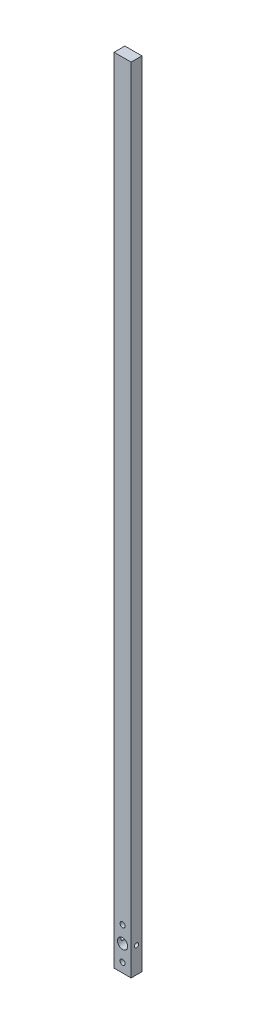
ISO-10303-21;
HEADER;
FILE_DESCRIPTION(('STEP AP214'),'2;1');
FILE_NAME('part.step','',(''),(''),'','','');
FILE_SCHEMA(('AUTOMOTIVE_DESIGN { 1 0 10303 214 1 1 1 1 }'));
ENDSEC;
DATA;
#1=APPLICATION_CONTEXT('core data for automotive mechanical design processes');
#2=APPLICATION_PROTOCOL_DEFINITION('international standard','automotive_design',2000,#1);
#3=PRODUCT_CONTEXT('',#1,'mechanical');
#4=PRODUCT('Part','Part','',(#3));
#5=PRODUCT_RELATED_PRODUCT_CATEGORY('part','',(#4));
#6=PRODUCT_DEFINITION_FORMATION('','',#4);
#7=PRODUCT_DEFINITION_CONTEXT('part definition',#1,'design');
#8=PRODUCT_DEFINITION('design','',#6,#7);
#9=PRODUCT_DEFINITION_SHAPE('','',#8);
#10=(LENGTH_UNIT() NAMED_UNIT(*) SI_UNIT(.MILLI.,.METRE.));
#11=(NAMED_UNIT(*) PLANE_ANGLE_UNIT() SI_UNIT($,.RADIAN.));
#12=(NAMED_UNIT(*) SI_UNIT($,.STERADIAN.) SOLID_ANGLE_UNIT());
#13=UNCERTAINTY_MEASURE_WITH_UNIT(LENGTH_MEASURE(1.E-05),#10,'distance_accuracy_value','');
#14=(GEOMETRIC_REPRESENTATION_CONTEXT(3) GLOBAL_UNCERTAINTY_ASSIGNED_CONTEXT((#13)) GLOBAL_UNIT_ASSIGNED_CONTEXT((#10,
#11,#12)) REPRESENTATION_CONTEXT('',''));
#15=CARTESIAN_POINT('',(0.,0.,0.));
#16=DIRECTION('',(0.,0.,1.));
#17=DIRECTION('',(1.,0.,0.));
#18=AXIS2_PLACEMENT_3D('',#15,#16,#17);
#19=CARTESIAN_POINT('',(0.,0.,6.35));
#20=DIRECTION('',(0.,0.,1.));
#21=DIRECTION('',(1.,0.,0.));
#22=AXIS2_PLACEMENT_3D('',#19,#20,#21);
#23=PLANE('',#22);
#24=CARTESIAN_POINT('',(0.,0.,6.35));
#25=DIRECTION('',(0.,0.,1.));
#26=DIRECTION('',(1.,0.,0.));
#27=AXIS2_PLACEMENT_3D('',#24,#25,#26);
#28=CIRCLE('',#27,3.);
#29=CARTESIAN_POINT('',(3.,0.,6.35));
#30=VERTEX_POINT('',#29);
#31=EDGE_CURVE('E184',#30,#30,#28,.T.);
#32=ORIENTED_EDGE('',*,*,#31,.F.);
#33=EDGE_LOOP('',(#32));
#34=FACE_BOUND('',#33,.T.);
#35=DIRECTION('',(0.,-1.,0.));
#36=VECTOR('',#35,1.);
#37=CARTESIAN_POINT('',(-5.00000000000006,450.,6.35));
#38=LINE('',#37,#36);
#39=CARTESIAN_POINT('',(-5.00000000000006,450.,6.35));
#40=VERTEX_POINT('',#39);
#41=CARTESIAN_POINT('',(-5.,-15.,6.35));
#42=VERTEX_POINT('',#41);
#43=EDGE_CURVE('E93',#40,#42,#38,.T.);
#44=ORIENTED_EDGE('',*,*,#43,.T.);
#45=DIRECTION('',(1.,0.,0.));
#46=VECTOR('',#45,1.);
#47=CARTESIAN_POINT('',(-5.,-15.,6.35));
#48=LINE('',#47,#46);
#49=CARTESIAN_POINT('',(5.,-15.,6.35));
#50=VERTEX_POINT('',#49);
#51=EDGE_CURVE('E88',#42,#50,#48,.T.);
#52=ORIENTED_EDGE('',*,*,#51,.T.);
#53=DIRECTION('',(0.,1.,0.));
#54=VECTOR('',#53,1.);
#55=CARTESIAN_POINT('',(4.99999999999995,450.,6.35));
#56=LINE('',#55,#54);
#57=CARTESIAN_POINT('',(4.99999999999995,450.,6.35));
#58=VERTEX_POINT('',#57);
#59=EDGE_CURVE('E91',#50,#58,#56,.T.);
#60=ORIENTED_EDGE('',*,*,#59,.T.);
#61=DIRECTION('',(-1.,0.,0.));
#62=VECTOR('',#61,1.);
#63=CARTESIAN_POINT('',(-5.00000000000006,450.,6.35));
#64=LINE('',#63,#62);
#65=EDGE_CURVE('E58',#58,#40,#64,.T.);
#66=ORIENTED_EDGE('',*,*,#65,.T.);
#67=EDGE_LOOP('',(#44,#52,#60,#66));
#68=FACE_BOUND('',#67,.T.);
#69=CARTESIAN_POINT('',(0.,-9.5,6.35));
#70=DIRECTION('',(0.,0.,1.));
#71=DIRECTION('',(1.,0.,0.));
#72=AXIS2_PLACEMENT_3D('',#69,#70,#71);
#73=CIRCLE('',#72,1.5);
#74=CARTESIAN_POINT('',(1.5,-9.5,6.35));
#75=VERTEX_POINT('',#74);
#76=EDGE_CURVE('E109',#75,#75,#73,.T.);
#77=ORIENTED_EDGE('',*,*,#76,.F.);
#78=EDGE_LOOP('',(#77));
#79=FACE_BOUND('',#78,.T.);
#80=CARTESIAN_POINT('',(0.,9.5,6.35));
#81=DIRECTION('',(0.,0.,1.));
#82=DIRECTION('',(1.,0.,0.));
#83=AXIS2_PLACEMENT_3D('',#80,#81,#82);
#84=CIRCLE('',#83,1.5);
#85=CARTESIAN_POINT('',(1.5,9.5,6.35));
#86=VERTEX_POINT('',#85);
#87=EDGE_CURVE('E178',#86,#86,#84,.T.);
#88=ORIENTED_EDGE('',*,*,#87,.F.);
#89=EDGE_LOOP('',(#88));
#90=FACE_BOUND('',#89,.T.);
#91=ADVANCED_FACE('F35',(#34,#68,#79,#90),#23,.T.);
#92=CARTESIAN_POINT('',(0.,0.,0.));
#93=DIRECTION('',(0.,0.,1.));
#94=DIRECTION('',(1.,0.,0.));
#95=AXIS2_PLACEMENT_3D('',#92,#93,#94);
#96=PLANE('',#95);
#97=DIRECTION('',(0.,-1.,0.));
#98=VECTOR('',#97,1.);
#99=CARTESIAN_POINT('',(-5.00000000000006,450.,0.));
#100=LINE('',#99,#98);
#101=CARTESIAN_POINT('',(-5.00000000000006,450.,0.));
#102=VERTEX_POINT('',#101);
#103=CARTESIAN_POINT('',(-5.,-15.,0.));
#104=VERTEX_POINT('',#103);
#105=EDGE_CURVE('E106',#102,#104,#100,.T.);
#106=ORIENTED_EDGE('',*,*,#105,.F.);
#107=DIRECTION('',(-1.,0.,0.));
#108=VECTOR('',#107,1.);
#109=CARTESIAN_POINT('',(-5.00000000000006,450.,0.));
#110=LINE('',#109,#108);
#111=CARTESIAN_POINT('',(4.99999999999995,450.,0.));
#112=VERTEX_POINT('',#111);
#113=EDGE_CURVE('E81',#112,#102,#110,.T.);
#114=ORIENTED_EDGE('',*,*,#113,.F.);
#115=DIRECTION('',(0.,1.,0.));
#116=VECTOR('',#115,1.);
#117=CARTESIAN_POINT('',(4.99999999999995,450.,0.));
#118=LINE('',#117,#116);
#119=CARTESIAN_POINT('',(5.,-15.,0.));
#120=VERTEX_POINT('',#119);
#121=EDGE_CURVE('E75',#120,#112,#118,.T.);
#122=ORIENTED_EDGE('',*,*,#121,.F.);
#123=DIRECTION('',(1.,0.,0.));
#124=VECTOR('',#123,1.);
#125=CARTESIAN_POINT('',(-5.,-15.,0.));
#126=LINE('',#125,#124);
#127=EDGE_CURVE('E97',#104,#120,#126,.T.);
#128=ORIENTED_EDGE('',*,*,#127,.F.);
#129=EDGE_LOOP('',(#106,#114,#122,#128));
#130=FACE_BOUND('',#129,.T.);
#131=CARTESIAN_POINT('',(0.,-9.5,0.));
#132=DIRECTION('',(0.,0.,1.));
#133=DIRECTION('',(1.,0.,0.));
#134=AXIS2_PLACEMENT_3D('',#131,#132,#133);
#135=CIRCLE('',#134,1.5);
#136=CARTESIAN_POINT('',(1.5,-9.5,0.));
#137=VERTEX_POINT('',#136);
#138=EDGE_CURVE('E170',#137,#137,#135,.T.);
#139=ORIENTED_EDGE('',*,*,#138,.T.);
#140=EDGE_LOOP('',(#139));
#141=FACE_BOUND('',#140,.T.);
#142=CARTESIAN_POINT('',(0.,0.,0.));
#143=DIRECTION('',(0.,0.,1.));
#144=DIRECTION('',(1.,0.,0.));
#145=AXIS2_PLACEMENT_3D('',#142,#143,#144);
#146=CIRCLE('',#145,3.);
#147=CARTESIAN_POINT('',(3.,0.,0.));
#148=VERTEX_POINT('',#147);
#149=EDGE_CURVE('E174',#148,#148,#146,.T.);
#150=ORIENTED_EDGE('',*,*,#149,.T.);
#151=EDGE_LOOP('',(#150));
#152=FACE_BOUND('',#151,.T.);
#153=CARTESIAN_POINT('',(0.,9.5,0.));
#154=DIRECTION('',(0.,0.,1.));
#155=DIRECTION('',(1.,0.,0.));
#156=AXIS2_PLACEMENT_3D('',#153,#154,#155);
#157=CIRCLE('',#156,1.5);
#158=CARTESIAN_POINT('',(1.5,9.5,0.));
#159=VERTEX_POINT('',#158);
#160=EDGE_CURVE('E177',#159,#159,#157,.T.);
#161=ORIENTED_EDGE('',*,*,#160,.T.);
#162=EDGE_LOOP('',(#161));
#163=FACE_BOUND('',#162,.T.);
#164=ADVANCED_FACE('F140',(#130,#141,#152,#163),#96,.F.);
#165=CARTESIAN_POINT('',(-5.00000000000006,450.,6.35));
#166=DIRECTION('',(1.,0.,0.));
#167=DIRECTION('',(0.,1.,0.));
#168=AXIS2_PLACEMENT_3D('',#165,#166,#167);
#169=PLANE('',#168);
#170=CARTESIAN_POINT('',(-5.00000000000006,0.,3.175));
#171=DIRECTION('',(1.,0.,0.));
#172=DIRECTION('',(0.,0.,-1.));
#173=AXIS2_PLACEMENT_3D('',#170,#171,#172);
#174=CIRCLE('',#173,1.25);
#175=CARTESIAN_POINT('',(-5.00000000000006,0.,1.925));
#176=VERTEX_POINT('',#175);
#177=EDGE_CURVE('E118',#176,#176,#174,.T.);
#178=ORIENTED_EDGE('',*,*,#177,.T.);
#179=EDGE_LOOP('',(#178));
#180=FACE_BOUND('',#179,.T.);
#181=ORIENTED_EDGE('',*,*,#105,.T.);
#182=DIRECTION('',(0.,0.,-1.));
#183=VECTOR('',#182,1.);
#184=CARTESIAN_POINT('',(-5.,-15.,6.35));
#185=LINE('',#184,#183);
#186=EDGE_CURVE('E11',#42,#104,#185,.T.);
#187=ORIENTED_EDGE('',*,*,#186,.F.);
#188=ORIENTED_EDGE('',*,*,#43,.F.);
#189=DIRECTION('',(0.,0.,-1.));
#190=VECTOR('',#189,1.);
#191=CARTESIAN_POINT('',(-5.00000000000006,450.,6.35));
#192=LINE('',#191,#190);
#193=EDGE_CURVE('E102',#40,#102,#192,.T.);
#194=ORIENTED_EDGE('',*,*,#193,.T.);
#195=EDGE_LOOP('',(#181,#187,#188,#194));
#196=FACE_BOUND('',#195,.T.);
#197=ADVANCED_FACE('F37',(#180,#196),#169,.F.);
#198=CARTESIAN_POINT('',(-5.,-15.,6.35));
#199=DIRECTION('',(0.,1.,0.));
#200=DIRECTION('',(0.,0.,1.));
#201=AXIS2_PLACEMENT_3D('',#198,#199,#200);
#202=PLANE('',#201);
#203=ORIENTED_EDGE('',*,*,#127,.T.);
#204=DIRECTION('',(0.,0.,-1.));
#205=VECTOR('',#204,1.);
#206=CARTESIAN_POINT('',(5.,-15.,6.35));
#207=LINE('',#206,#205);
#208=EDGE_CURVE('E49',#50,#120,#207,.T.);
#209=ORIENTED_EDGE('',*,*,#208,.F.);
#210=ORIENTED_EDGE('',*,*,#51,.F.);
#211=ORIENTED_EDGE('',*,*,#186,.T.);
#212=EDGE_LOOP('',(#203,#209,#210,#211));
#213=FACE_BOUND('',#212,.T.);
#214=ADVANCED_FACE('F96',(#213),#202,.F.);
#215=CARTESIAN_POINT('',(4.99999999999995,450.,6.35));
#216=DIRECTION('',(-1.,0.,0.));
#217=DIRECTION('',(0.,-1.,0.));
#218=AXIS2_PLACEMENT_3D('',#215,#216,#217);
#219=PLANE('',#218);
#220=CARTESIAN_POINT('',(5.,0.,3.175));
#221=DIRECTION('',(1.,0.,0.));
#222=DIRECTION('',(0.,0.,-1.));
#223=AXIS2_PLACEMENT_3D('',#220,#221,#222);
#224=CIRCLE('',#223,1.24999999999999);
#225=CARTESIAN_POINT('',(5.,0.,1.92500000000001));
#226=VERTEX_POINT('',#225);
#227=EDGE_CURVE('E228',#226,#226,#224,.T.);
#228=ORIENTED_EDGE('',*,*,#227,.F.);
#229=EDGE_LOOP('',(#228));
#230=FACE_BOUND('',#229,.T.);
#231=ORIENTED_EDGE('',*,*,#121,.T.);
#232=DIRECTION('',(0.,0.,-1.));
#233=VECTOR('',#232,1.);
#234=CARTESIAN_POINT('',(4.99999999999995,450.,6.35));
#235=LINE('',#234,#233);
#236=EDGE_CURVE('E98',#58,#112,#235,.T.);
#237=ORIENTED_EDGE('',*,*,#236,.F.);
#238=ORIENTED_EDGE('',*,*,#59,.F.);
#239=ORIENTED_EDGE('',*,*,#208,.T.);
#240=EDGE_LOOP('',(#231,#237,#238,#239));
#241=FACE_BOUND('',#240,.T.);
#242=ADVANCED_FACE('F100',(#230,#241),#219,.F.);
#243=CARTESIAN_POINT('',(-5.00000000000006,450.,6.35));
#244=DIRECTION('',(0.,-1.,0.));
#245=DIRECTION('',(0.,0.,-1.));
#246=AXIS2_PLACEMENT_3D('',#243,#244,#245);
#247=PLANE('',#246);
#248=ORIENTED_EDGE('',*,*,#113,.T.);
#249=ORIENTED_EDGE('',*,*,#193,.F.);
#250=ORIENTED_EDGE('',*,*,#65,.F.);
#251=ORIENTED_EDGE('',*,*,#236,.T.);
#252=EDGE_LOOP('',(#248,#249,#250,#251));
#253=FACE_BOUND('',#252,.T.);
#254=ADVANCED_FACE('F150',(#253),#247,.F.);
#255=CARTESIAN_POINT('',(0.,-9.5,6.35));
#256=DIRECTION('',(0.,0.,-1.));
#257=DIRECTION('',(-1.,0.,0.));
#258=AXIS2_PLACEMENT_3D('',#255,#256,#257);
#259=CYLINDRICAL_SURFACE('',#258,1.5);
#260=ORIENTED_EDGE('',*,*,#76,.T.);
#261=EDGE_LOOP('',(#260));
#262=FACE_BOUND('',#261,.T.);
#263=ORIENTED_EDGE('',*,*,#138,.F.);
#264=EDGE_LOOP('',(#263));
#265=FACE_BOUND('',#264,.T.);
#266=ADVANCED_FACE('F135',(#262,#265),#259,.F.);
#267=CARTESIAN_POINT('',(0.,0.,6.35));
#268=DIRECTION('',(0.,0.,-1.));
#269=DIRECTION('',(-1.,0.,0.));
#270=AXIS2_PLACEMENT_3D('',#267,#268,#269);
#271=CYLINDRICAL_SURFACE('',#270,3.);
#272=CARTESIAN_POINT('',(-3.,0.,4.42499999999999));
#273=CARTESIAN_POINT('',(-2.99999458367273,-0.0669580526362665,4.42499279490869));
#274=CARTESIAN_POINT('',(-2.9977323297471,-0.13402139706384,4.41958804147186));
#275=CARTESIAN_POINT('',(-2.98890153579552,-0.266247371156346,4.39816093507981));
#276=CARTESIAN_POINT('',(-2.98232175901028,-0.331404576423563,4.38211087553575));
#277=CARTESIAN_POINT('',(-2.96556289038127,-0.457688733653085,4.34008890821941));
#278=CARTESIAN_POINT('',(-2.95539599975004,-0.518828524426266,4.31415061053185));
#279=CARTESIAN_POINT('',(-2.93245286470664,-0.635829756679799,4.25322717676743));
#280=CARTESIAN_POINT('',(-2.91967741092849,-0.691692790015936,4.21824478102913));
#281=CARTESIAN_POINT('',(-2.89207828351869,-0.799448403559507,4.13837101740911));
#282=CARTESIAN_POINT('',(-2.87718753326093,-0.851041267517764,4.09309869121024));
#283=CARTESIAN_POINT('',(-2.84732714068514,-0.946159821091257,3.99473566521743));
#284=CARTESIAN_POINT('',(-2.8323574610681,-0.98968126315308,3.94164087510549));
#285=CARTESIAN_POINT('',(-2.80321021812995,-1.06953737697065,3.8259732224351));
#286=CARTESIAN_POINT('',(-2.78910786873385,-1.10541308153924,3.76306255157345));
#287=CARTESIAN_POINT('',(-2.76435572357005,-1.16593940588865,3.63142674207907));
#288=CARTESIAN_POINT('',(-2.75370415000824,-1.1905958083629,3.56270462051555));
#289=CARTESIAN_POINT('',(-2.73778555387705,-1.22674598312158,3.42484630823208));
#290=CARTESIAN_POINT('',(-2.73228387651787,-1.23881657877605,3.35588951660784));
#291=CARTESIAN_POINT('',(-2.72661326219504,-1.25125209967796,3.21672670731343));
#292=CARTESIAN_POINT('',(-2.7264413842526,-1.25162348054397,3.14652139997426));
#293=CARTESIAN_POINT('',(-2.73125119560853,-1.24108450363673,3.01259993956506));
#294=CARTESIAN_POINT('',(-2.73583882723623,-1.231036811123,2.94879890343554));
#295=CARTESIAN_POINT('',(-2.74898482773797,-1.20139191015776,2.82388790899961));
#296=CARTESIAN_POINT('',(-2.75754395703564,-1.18179287287176,2.76277846850823));
#297=CARTESIAN_POINT('',(-2.77786184772757,-1.1332195872757,2.64344229700856));
#298=CARTESIAN_POINT('',(-2.78968481949136,-1.10405471539235,2.58530457908662));
#299=CARTESIAN_POINT('',(-2.81518331141086,-1.03731242580562,2.47452226611986));
#300=CARTESIAN_POINT('',(-2.8288595612978,-0.999731690519538,2.42187984938649));
#301=CARTESIAN_POINT('',(-2.85792976877979,-0.913495965543829,2.31890004126716));
#302=CARTESIAN_POINT('',(-2.87337121404473,-0.864173483207521,2.26913343261457));
#303=CARTESIAN_POINT('',(-2.90325673112529,-0.757729591051507,2.17838649704082));
#304=CARTESIAN_POINT('',(-2.9177005687701,-0.700606359448452,2.13740822830783));
#305=CARTESIAN_POINT('',(-2.94438283556473,-0.578447948693372,2.06456417638374));
#306=CARTESIAN_POINT('',(-2.95656266543334,-0.513260582447676,2.03293055484932));
#307=CARTESIAN_POINT('',(-2.97689481414803,-0.377852402526828,1.98127886039675));
#308=CARTESIAN_POINT('',(-2.985049358458,-0.307634394795032,1.96125436805619));
#309=CARTESIAN_POINT('',(-2.99599641186385,-0.168928113346226,1.93458400787337));
#310=CARTESIAN_POINT('',(-2.99909541047125,-0.100611285278637,1.92717214255626));
#311=CARTESIAN_POINT('',(-3.00056050368745,0.0363546554960904,1.92365377638591));
#312=CARTESIAN_POINT('',(-2.99892795711939,0.105003667152637,1.92754402974801));
#313=CARTESIAN_POINT('',(-2.9913121765694,0.237098242341435,1.94597108480607));
#314=CARTESIAN_POINT('',(-2.9855488728399,0.300632966639386,1.9599699540972));
#315=CARTESIAN_POINT('',(-2.97048606772414,0.42438274897109,1.99746819454079));
#316=CARTESIAN_POINT('',(-2.96118611959704,0.48459738651836,2.02096876595031));
#317=CARTESIAN_POINT('',(-2.93958270645166,0.602108999869135,2.07757097571212));
#318=CARTESIAN_POINT('',(-2.92719491469281,0.659257236855323,2.11094818314604));
#319=CARTESIAN_POINT('',(-2.9007380457909,0.767346216231427,2.1860533777917));
#320=CARTESIAN_POINT('',(-2.88666826768733,0.818284352601939,2.22778485152928));
#321=CARTESIAN_POINT('',(-2.85712087895438,0.916333430274261,2.32190323327241));
#322=CARTESIAN_POINT('',(-2.84161451591029,0.962910697979833,2.37483850298627));
#323=CARTESIAN_POINT('',(-2.81184336768005,1.04666984610551,2.4880212759354));
#324=CARTESIAN_POINT('',(-2.79757886493439,1.08384959285617,2.54827043517174));
#325=CARTESIAN_POINT('',(-2.77181386243988,1.14815960208699,2.67561417530258));
#326=CARTESIAN_POINT('',(-2.76035562555112,1.17513918237328,2.74279403551483));
#327=CARTESIAN_POINT('',(-2.74208355658957,1.21717413951572,2.88137059381011));
#328=CARTESIAN_POINT('',(-2.73526589555752,1.23223934863687,2.95276376248335));
#329=CARTESIAN_POINT('',(-2.72763164537264,1.249040803489,3.09181869919921));
#330=CARTESIAN_POINT('',(-2.72639350967163,1.25171380413129,3.15934466229262));
#331=CARTESIAN_POINT('',(-2.72893853011024,1.24615575523912,3.2938428611411));
#332=CARTESIAN_POINT('',(-2.73272091540307,1.23792637964721,3.3608151803137));
#333=CARTESIAN_POINT('',(-2.74449551302268,1.21158404780491,3.48909274746889));
#334=CARTESIAN_POINT('',(-2.75228354846481,1.19394903571465,3.55051667346339));
#335=CARTESIAN_POINT('',(-2.77103181199189,1.14976328202134,3.66954802135723));
#336=CARTESIAN_POINT('',(-2.78199293131694,1.12321003517251,3.72715436539878));
#337=CARTESIAN_POINT('',(-2.80666954560013,1.06010285935489,3.84069589594912));
#338=CARTESIAN_POINT('',(-2.8205110271368,1.02304360910483,3.89632233016829));
#339=CARTESIAN_POINT('',(-2.8490368905384,0.940684072630385,4.00086013936068));
#340=CARTESIAN_POINT('',(-2.86372156345875,0.895380928905613,4.04976917560057));
#341=CARTESIAN_POINT('',(-2.89356392850106,0.793902045778815,4.14314868168474));
#342=CARTESIAN_POINT('',(-2.90867817511792,0.737174739949022,4.18703643284065));
#343=CARTESIAN_POINT('',(-2.9366014362202,0.616600079253194,4.26469945354362));
#344=CARTESIAN_POINT('',(-2.94940939916741,0.552749497945741,4.29847011488955));
#345=CARTESIAN_POINT('',(-2.97109183362461,0.420732056717946,4.35420984543988));
#346=CARTESIAN_POINT('',(-2.98002782581964,0.352653990980632,4.37636476661729));
#347=CARTESIAN_POINT('',(-2.99321009768625,0.213410421846555,4.40870632907783));
#348=CARTESIAN_POINT('',(-2.99747105811967,0.142255316980955,4.41893044252988));
#349=CARTESIAN_POINT('',(-2.99972287568934,0.0472360819191816,4.42433316108644));
#350=CARTESIAN_POINT('',(-3.00000191102536,0.0236245946756562,4.42500254214922));
#351=CARTESIAN_POINT('',(-3.,0.,4.42499999999999));
#352=B_SPLINE_CURVE_WITH_KNOTS('',3,(#272,#273,#274,#275,#276,#277,#278,#279,#280,#281,#282,
#283,#284,#285,#286,#287,#288,#289,#290,#291,#292,#293,#294,#295,#296,#297,#298,#299,#300,#301,
#302,#303,#304,#305,#306,#307,#308,#309,#310,#311,#312,#313,#314,#315,#316,#317,#318,#319,#320,
#321,#322,#323,#324,#325,#326,#327,#328,#329,#330,#331,#332,#333,#334,#335,#336,#337,#338,#339,
#340,#341,#342,#343,#344,#345,#346,#347,#348,#349,#350,#351),.UNSPECIFIED.,.T.,.F.,(4,2,2,2,2,2,
2,2,2,2,2,2,2,2,2,2,2,2,2,2,2,2,2,2,2,2,2,2,2,2,2,2,2,2,2,2,2,2,2,4),(0.,0.200806918883938,
0.402138540628694,0.602791851906298,0.80338443685297,1.01317936288806,1.22308438131465,
1.44331724539125,1.66343646730587,1.87295273137557,2.08235338249045,2.27570157202555,
2.46908679727211,2.66658713058713,2.86416545717205,3.07844141127895,3.29276749314586,
3.51204055060812,3.73119224218295,3.93648443393249,4.1417176749317,4.33676589735719,
4.53183876601783,4.73297135272159,4.93418805469493,5.14978488029292,5.36543061240339,
5.58414788359521,5.80268447074578,6.00439877559641,6.20608211297533,6.39837649964759,
6.59072494950609,6.79463893397438,6.99862373425941,7.21746535004886,7.43640649428579,
7.65172855819382,7.86637250469317,7.93722256499094),.UNSPECIFIED.);
#353=CARTESIAN_POINT('',(-3.,0.,4.42499999999999));
#354=VERTEX_POINT('',#353);
#355=EDGE_CURVE('E39',#354,#354,#352,.T.);
#356=ORIENTED_EDGE('',*,*,#355,.F.);
#357=EDGE_LOOP('',(#356));
#358=FACE_BOUND('',#357,.T.);
#359=CARTESIAN_POINT('',(3.,0.,1.92500000000001));
#360=CARTESIAN_POINT('',(2.99999458367273,-0.0669580526362658,1.9250072050913));
#361=CARTESIAN_POINT('',(2.9977323297471,-0.13402139706384,1.93041195852814));
#362=CARTESIAN_POINT('',(2.98890153579552,-0.266247371156345,1.95183906492018));
#363=CARTESIAN_POINT('',(2.98232175901028,-0.331404576423562,1.96788912446425));
#364=CARTESIAN_POINT('',(2.96556289038127,-0.457688733653085,2.00991109178059));
#365=CARTESIAN_POINT('',(2.95539599975004,-0.518828524426265,2.03584938946815));
#366=CARTESIAN_POINT('',(2.93245286470664,-0.635829756679798,2.09677282323257));
#367=CARTESIAN_POINT('',(2.91967741092849,-0.691692790015935,2.13175521897087));
#368=CARTESIAN_POINT('',(2.89207828351869,-0.799448403559507,2.21162898259089));
#369=CARTESIAN_POINT('',(2.87718753326093,-0.851041267517764,2.25690130878976));
#370=CARTESIAN_POINT('',(2.84732714068514,-0.946159821091257,2.35526433478257));
#371=CARTESIAN_POINT('',(2.8323574610681,-0.98968126315308,2.40835912489451));
#372=CARTESIAN_POINT('',(2.80321021812995,-1.06953737697065,2.5240267775649));
#373=CARTESIAN_POINT('',(2.78910786873385,-1.10541308153924,2.58693744842655));
#374=CARTESIAN_POINT('',(2.76435572357005,-1.16593940588865,2.71857325792093));
#375=CARTESIAN_POINT('',(2.75370415000824,-1.1905958083629,2.78729537948445));
#376=CARTESIAN_POINT('',(2.73778555387705,-1.22674598312158,2.92515369176792));
#377=CARTESIAN_POINT('',(2.73228387651787,-1.23881657877605,2.99411048339215));
#378=CARTESIAN_POINT('',(2.72661326219504,-1.25125209967796,3.13327329268657));
#379=CARTESIAN_POINT('',(2.7264413842526,-1.25162348054397,3.20347860002574));
#380=CARTESIAN_POINT('',(2.73125119560853,-1.24108450363673,3.33740006043494));
#381=CARTESIAN_POINT('',(2.73583882723623,-1.231036811123,3.40120109656446));
#382=CARTESIAN_POINT('',(2.74898482773797,-1.20139191015776,3.52611209100039));
#383=CARTESIAN_POINT('',(2.75754395703564,-1.18179287287176,3.58722153149177));
#384=CARTESIAN_POINT('',(2.77786184772757,-1.1332195872757,3.70655770299144));
#385=CARTESIAN_POINT('',(2.78968481949137,-1.10405471539235,3.76469542091338));
#386=CARTESIAN_POINT('',(2.81518331141086,-1.03731242580562,3.87547773388014));
#387=CARTESIAN_POINT('',(2.8288595612978,-0.999731690519538,3.92812015061351));
#388=CARTESIAN_POINT('',(2.85792976877979,-0.91349596554383,4.03109995873283));
#389=CARTESIAN_POINT('',(2.87337121404473,-0.864173483207521,4.08086656738543));
#390=CARTESIAN_POINT('',(2.90325673112529,-0.757729591051507,4.17161350295918));
#391=CARTESIAN_POINT('',(2.9177005687701,-0.700606359448452,4.21259177169217));
#392=CARTESIAN_POINT('',(2.94438283556473,-0.578447948693372,4.28543582361626));
#393=CARTESIAN_POINT('',(2.95656266543334,-0.513260582447677,4.31706944515068));
#394=CARTESIAN_POINT('',(2.97689481414803,-0.37785240252683,4.36872113960325));
#395=CARTESIAN_POINT('',(2.985049358458,-0.307634394795033,4.38874563194381));
#396=CARTESIAN_POINT('',(2.99599641186385,-0.168928113346227,4.41541599212663));
#397=CARTESIAN_POINT('',(2.99909541047125,-0.100611285278638,4.42282785744374));
#398=CARTESIAN_POINT('',(3.00056050368745,0.0363546554960891,4.42634622361409));
#399=CARTESIAN_POINT('',(2.99892795711939,0.105003667152635,4.42245597025199));
#400=CARTESIAN_POINT('',(2.9913121765694,0.237098242341434,4.40402891519393));
#401=CARTESIAN_POINT('',(2.9855488728399,0.300632966639385,4.3900300459028));
#402=CARTESIAN_POINT('',(2.97048606772414,0.424382748971089,4.35253180545921));
#403=CARTESIAN_POINT('',(2.96118611959704,0.484597386518359,4.32903123404969));
#404=CARTESIAN_POINT('',(2.93958270645166,0.602108999869134,4.27242902428788));
#405=CARTESIAN_POINT('',(2.92719491469281,0.659257236855322,4.23905181685396));
#406=CARTESIAN_POINT('',(2.9007380457909,0.767346216231426,4.1639466222083));
#407=CARTESIAN_POINT('',(2.88666826768733,0.818284352601938,4.12221514847072));
#408=CARTESIAN_POINT('',(2.85712087895438,0.91633343027426,4.02809676672759));
#409=CARTESIAN_POINT('',(2.84161451591029,0.962910697979831,3.97516149701373));
#410=CARTESIAN_POINT('',(2.81184336768005,1.0466698461055,3.8619787240646));
#411=CARTESIAN_POINT('',(2.79757886493439,1.08384959285617,3.80172956482826));
#412=CARTESIAN_POINT('',(2.77181386243988,1.14815960208699,3.67438582469742));
#413=CARTESIAN_POINT('',(2.76035562555112,1.17513918237328,3.60720596448517));
#414=CARTESIAN_POINT('',(2.74208355658957,1.21717413951572,3.46862940618989));
#415=CARTESIAN_POINT('',(2.73526589555752,1.23223934863687,3.39723623751665));
#416=CARTESIAN_POINT('',(2.72763164537264,1.249040803489,3.25818130080079));
#417=CARTESIAN_POINT('',(2.72639350967163,1.25171380413129,3.19065533770738));
#418=CARTESIAN_POINT('',(2.72893853011024,1.24615575523912,3.0561571388589));
#419=CARTESIAN_POINT('',(2.73272091540307,1.23792637964721,2.98918481968631));
#420=CARTESIAN_POINT('',(2.74449551302268,1.21158404780491,2.86090725253111));
#421=CARTESIAN_POINT('',(2.75228354846481,1.19394903571466,2.79948332653661));
#422=CARTESIAN_POINT('',(2.77103181199189,1.14976328202134,2.68045197864277));
#423=CARTESIAN_POINT('',(2.78199293131694,1.12321003517251,2.62284563460122));
#424=CARTESIAN_POINT('',(2.80666954560013,1.06010285935489,2.50930410405088));
#425=CARTESIAN_POINT('',(2.8205110271368,1.02304360910483,2.45367766983171));
#426=CARTESIAN_POINT('',(2.84903689053839,0.940684072630386,2.34913986063932));
#427=CARTESIAN_POINT('',(2.86372156345875,0.895380928905614,2.30023082439943));
#428=CARTESIAN_POINT('',(2.89356392850106,0.793902045778816,2.20685131831526));
#429=CARTESIAN_POINT('',(2.90867817511792,0.737174739949024,2.16296356715935));
#430=CARTESIAN_POINT('',(2.9366014362202,0.616600079253195,2.08530054645638));
#431=CARTESIAN_POINT('',(2.94940939916741,0.552749497945742,2.05152988511045));
#432=CARTESIAN_POINT('',(2.97109183362461,0.420732056717947,1.99579015456012));
#433=CARTESIAN_POINT('',(2.98002782581964,0.352653990980633,1.97363523338271));
#434=CARTESIAN_POINT('',(2.99321009768625,0.213410421846556,1.94129367092217));
#435=CARTESIAN_POINT('',(2.99747105811967,0.142255316980956,1.93106955747012));
#436=CARTESIAN_POINT('',(2.99972287568934,0.0472360819191825,1.92566683891356));
#437=CARTESIAN_POINT('',(3.00000191102536,0.023624594675657,1.92499745785078));
#438=CARTESIAN_POINT('',(3.,0.,1.92500000000001));
#439=B_SPLINE_CURVE_WITH_KNOTS('',3,(#359,#360,#361,#362,#363,#364,#365,#366,#367,#368,#369,
#370,#371,#372,#373,#374,#375,#376,#377,#378,#379,#380,#381,#382,#383,#384,#385,#386,#387,#388,
#389,#390,#391,#392,#393,#394,#395,#396,#397,#398,#399,#400,#401,#402,#403,#404,#405,#406,#407,
#408,#409,#410,#411,#412,#413,#414,#415,#416,#417,#418,#419,#420,#421,#422,#423,#424,#425,#426,
#427,#428,#429,#430,#431,#432,#433,#434,#435,#436,#437,#438),.UNSPECIFIED.,.T.,.F.,(4,2,2,2,2,2,
2,2,2,2,2,2,2,2,2,2,2,2,2,2,2,2,2,2,2,2,2,2,2,2,2,2,2,2,2,2,2,2,2,4),(0.,0.200806918883938,
0.402138540628694,0.602791851906297,0.80338443685297,1.01317936288806,1.22308438131465,
1.44331724539125,1.66343646730587,1.87295273137557,2.08235338249045,2.27570157202555,
2.46908679727211,2.66658713058713,2.86416545717205,3.07844141127895,3.29276749314586,
3.51204055060811,3.73119224218295,3.93648443393249,4.1417176749317,4.33676589735719,
4.53183876601783,4.73297135272159,4.93418805469493,5.14978488029292,5.36543061240339,
5.58414788359521,5.80268447074578,6.00439877559641,6.20608211297533,6.39837649964759,
6.59072494950609,6.79463893397438,6.99862373425941,7.21746535004886,7.43640649428579,
7.65172855819382,7.86637250469318,7.93722256499094),.UNSPECIFIED.);
#440=CARTESIAN_POINT('',(3.,0.,1.92500000000001));
#441=VERTEX_POINT('',#440);
#442=EDGE_CURVE('E114',#441,#441,#439,.T.);
#443=ORIENTED_EDGE('',*,*,#442,.F.);
#444=EDGE_LOOP('',(#443));
#445=FACE_BOUND('',#444,.T.);
#446=ORIENTED_EDGE('',*,*,#31,.T.);
#447=EDGE_LOOP('',(#446));
#448=FACE_BOUND('',#447,.T.);
#449=ORIENTED_EDGE('',*,*,#149,.F.);
#450=EDGE_LOOP('',(#449));
#451=FACE_BOUND('',#450,.T.);
#452=ADVANCED_FACE('F119',(#358,#445,#448,#451),#271,.F.);
#453=CARTESIAN_POINT('',(0.,9.5,6.35));
#454=DIRECTION('',(0.,0.,-1.));
#455=DIRECTION('',(-1.,0.,0.));
#456=AXIS2_PLACEMENT_3D('',#453,#454,#455);
#457=CYLINDRICAL_SURFACE('',#456,1.5);
#458=ORIENTED_EDGE('',*,*,#87,.T.);
#459=EDGE_LOOP('',(#458));
#460=FACE_BOUND('',#459,.T.);
#461=ORIENTED_EDGE('',*,*,#160,.F.);
#462=EDGE_LOOP('',(#461));
#463=FACE_BOUND('',#462,.T.);
#464=ADVANCED_FACE('F127',(#460,#463),#457,.F.);
#465=CARTESIAN_POINT('',(5.,0.,3.175));
#466=DIRECTION('',(1.,0.,0.));
#467=DIRECTION('',(0.,0.,-1.));
#468=AXIS2_PLACEMENT_3D('',#465,#466,#467);
#469=CYLINDRICAL_SURFACE('',#468,1.24999999999999);
#470=ORIENTED_EDGE('',*,*,#442,.T.);
#471=EDGE_LOOP('',(#470));
#472=FACE_BOUND('',#471,.T.);
#473=ORIENTED_EDGE('',*,*,#227,.T.);
#474=EDGE_LOOP('',(#473));
#475=FACE_BOUND('',#474,.T.);
#476=ADVANCED_FACE('F123',(#472,#475),#469,.F.);
#477=ORIENTED_EDGE('',*,*,#355,.T.);
#478=EDGE_LOOP('',(#477));
#479=FACE_BOUND('',#478,.T.);
#480=ORIENTED_EDGE('',*,*,#177,.F.);
#481=EDGE_LOOP('',(#480));
#482=FACE_BOUND('',#481,.T.);
#483=ADVANCED_FACE('F126',(#479,#482),#469,.F.);
#484=CLOSED_SHELL('',(#91,#164,#197,#214,#242,#254,#266,#452,#464,#476,#483));
#485=MANIFOLD_SOLID_BREP('B2',#484);
#486=ADVANCED_BREP_SHAPE_REPRESENTATION('',(#18,#485),#14);
#487=SHAPE_DEFINITION_REPRESENTATION(#9,#486);
ENDSEC;
END-ISO-10303-21;
